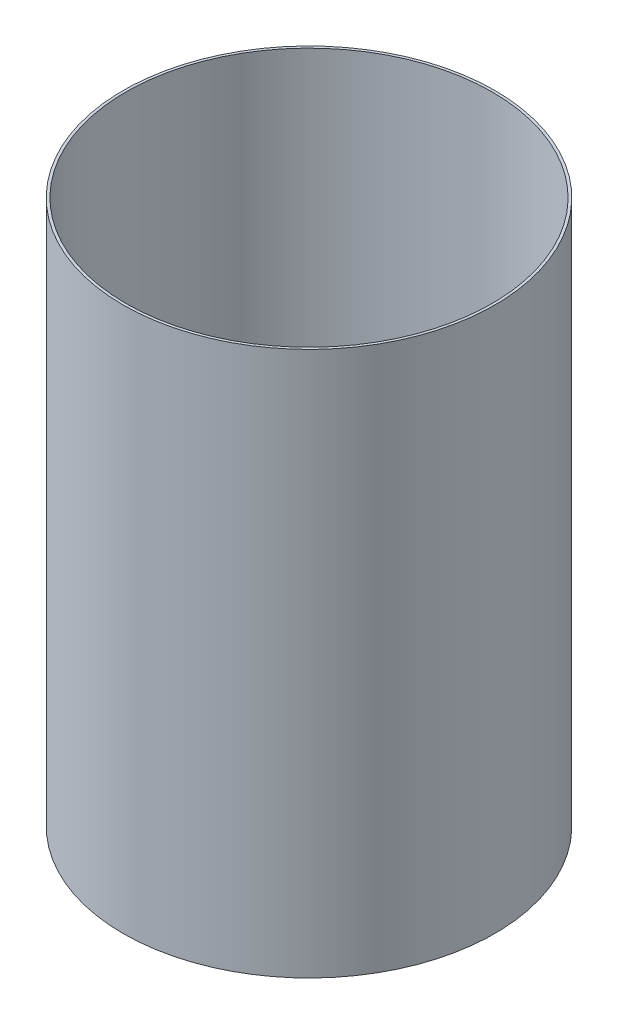
ISO-10303-21;
HEADER;
FILE_DESCRIPTION(('STEP AP214'),'2;1');
FILE_NAME('part.step','',(''),(''),'','','');
FILE_SCHEMA(('AUTOMOTIVE_DESIGN { 1 0 10303 214 1 1 1 1 }'));
ENDSEC;
DATA;
#1=APPLICATION_CONTEXT('core data for automotive mechanical design processes');
#2=APPLICATION_PROTOCOL_DEFINITION('international standard','automotive_design',2000,#1);
#3=PRODUCT_CONTEXT('',#1,'mechanical');
#4=PRODUCT('Part','Part','',(#3));
#5=PRODUCT_RELATED_PRODUCT_CATEGORY('part','',(#4));
#6=PRODUCT_DEFINITION_FORMATION('','',#4);
#7=PRODUCT_DEFINITION_CONTEXT('part definition',#1,'design');
#8=PRODUCT_DEFINITION('design','',#6,#7);
#9=PRODUCT_DEFINITION_SHAPE('','',#8);
#10=(LENGTH_UNIT() NAMED_UNIT(*) SI_UNIT(.MILLI.,.METRE.));
#11=(NAMED_UNIT(*) PLANE_ANGLE_UNIT() SI_UNIT($,.RADIAN.));
#12=(NAMED_UNIT(*) SI_UNIT($,.STERADIAN.) SOLID_ANGLE_UNIT());
#13=UNCERTAINTY_MEASURE_WITH_UNIT(LENGTH_MEASURE(1.E-05),#10,'distance_accuracy_value','');
#14=(GEOMETRIC_REPRESENTATION_CONTEXT(3) GLOBAL_UNCERTAINTY_ASSIGNED_CONTEXT((#13)) GLOBAL_UNIT_ASSIGNED_CONTEXT((#10,
#11,#12)) REPRESENTATION_CONTEXT('',''));
#15=CARTESIAN_POINT('',(0.,0.,0.));
#16=DIRECTION('',(0.,0.,1.));
#17=DIRECTION('',(1.,0.,0.));
#18=AXIS2_PLACEMENT_3D('',#15,#16,#17);
#19=CARTESIAN_POINT('',(0.,206.,0.));
#20=DIRECTION('',(0.,1.,0.));
#21=DIRECTION('',(0.,0.,1.));
#22=AXIS2_PLACEMENT_3D('',#19,#20,#21);
#23=PLANE('',#22);
#24=CARTESIAN_POINT('',(0.,206.,0.));
#25=DIRECTION('',(0.,1.,0.));
#26=DIRECTION('',(0.,0.,1.));
#27=AXIS2_PLACEMENT_3D('',#24,#25,#26);
#28=CIRCLE('',#27,71.);
#29=CARTESIAN_POINT('',(0.,206.,71.));
#30=VERTEX_POINT('',#29);
#31=EDGE_CURVE('E10',#30,#30,#28,.T.);
#32=ORIENTED_EDGE('',*,*,#31,.T.);
#33=EDGE_LOOP('',(#32));
#34=FACE_BOUND('',#33,.T.);
#35=CARTESIAN_POINT('',(0.,206.,0.));
#36=DIRECTION('',(0.,1.,0.));
#37=DIRECTION('',(0.,0.,1.));
#38=AXIS2_PLACEMENT_3D('',#35,#36,#37);
#39=CIRCLE('',#38,70.);
#40=CARTESIAN_POINT('',(0.,206.,70.));
#41=VERTEX_POINT('',#40);
#42=EDGE_CURVE('E41',#41,#41,#39,.T.);
#43=ORIENTED_EDGE('',*,*,#42,.F.);
#44=EDGE_LOOP('',(#43));
#45=FACE_BOUND('',#44,.T.);
#46=ADVANCED_FACE('F34',(#34,#45),#23,.T.);
#47=CARTESIAN_POINT('',(0.,206.,0.));
#48=DIRECTION('',(0.,-1.,0.));
#49=DIRECTION('',(0.,0.,-1.));
#50=AXIS2_PLACEMENT_3D('',#47,#48,#49);
#51=CYLINDRICAL_SURFACE('',#50,71.);
#52=ORIENTED_EDGE('',*,*,#31,.F.);
#53=EDGE_LOOP('',(#52));
#54=FACE_BOUND('',#53,.T.);
#55=CARTESIAN_POINT('',(0.,-2.,0.));
#56=DIRECTION('',(0.,-1.,0.));
#57=DIRECTION('',(0.,0.,-1.));
#58=AXIS2_PLACEMENT_3D('',#55,#56,#57);
#59=CIRCLE('',#58,71.);
#60=CARTESIAN_POINT('',(0.,-2.,-71.));
#61=VERTEX_POINT('',#60);
#62=EDGE_CURVE('E50',#61,#61,#59,.T.);
#63=ORIENTED_EDGE('',*,*,#62,.F.);
#64=EDGE_LOOP('',(#63));
#65=FACE_BOUND('',#64,.T.);
#66=ADVANCED_FACE('F36',(#54,#65),#51,.T.);
#67=CARTESIAN_POINT('',(0.,206.,0.));
#68=DIRECTION('',(0.,-1.,0.));
#69=DIRECTION('',(0.,0.,-1.));
#70=AXIS2_PLACEMENT_3D('',#67,#68,#69);
#71=CYLINDRICAL_SURFACE('',#70,70.);
#72=ORIENTED_EDGE('',*,*,#42,.T.);
#73=EDGE_LOOP('',(#72));
#74=FACE_BOUND('',#73,.T.);
#75=CARTESIAN_POINT('',(0.,0.,0.));
#76=DIRECTION('',(0.,1.,0.));
#77=DIRECTION('',(0.,0.,1.));
#78=AXIS2_PLACEMENT_3D('',#75,#76,#77);
#79=CIRCLE('',#78,70.);
#80=CARTESIAN_POINT('',(0.,0.,70.));
#81=VERTEX_POINT('',#80);
#82=EDGE_CURVE('E45',#81,#81,#79,.T.);
#83=ORIENTED_EDGE('',*,*,#82,.F.);
#84=EDGE_LOOP('',(#83));
#85=FACE_BOUND('',#84,.T.);
#86=ADVANCED_FACE('F58',(#74,#85),#71,.F.);
#87=CARTESIAN_POINT('',(0.,0.,0.));
#88=DIRECTION('',(0.,-1.,0.));
#89=DIRECTION('',(0.,0.,-1.));
#90=AXIS2_PLACEMENT_3D('',#87,#88,#89);
#91=PLANE('',#90);
#92=ORIENTED_EDGE('',*,*,#82,.T.);
#93=EDGE_LOOP('',(#92));
#94=FACE_BOUND('',#93,.T.);
#95=ADVANCED_FACE('F64',(#94),#91,.F.);
#96=CARTESIAN_POINT('',(0.,-2.,0.));
#97=DIRECTION('',(0.,-1.,0.));
#98=DIRECTION('',(0.,0.,-1.));
#99=AXIS2_PLACEMENT_3D('',#96,#97,#98);
#100=PLANE('',#99);
#101=ORIENTED_EDGE('',*,*,#62,.T.);
#102=EDGE_LOOP('',(#101));
#103=FACE_BOUND('',#102,.T.);
#104=ADVANCED_FACE('F55',(#103),#100,.T.);
#105=CLOSED_SHELL('',(#46,#66,#86,#95,#104));
#106=MANIFOLD_SOLID_BREP('B2',#105);
#107=ADVANCED_BREP_SHAPE_REPRESENTATION('',(#18,#106),#14);
#108=SHAPE_DEFINITION_REPRESENTATION(#9,#107);
ENDSEC;
END-ISO-10303-21;
